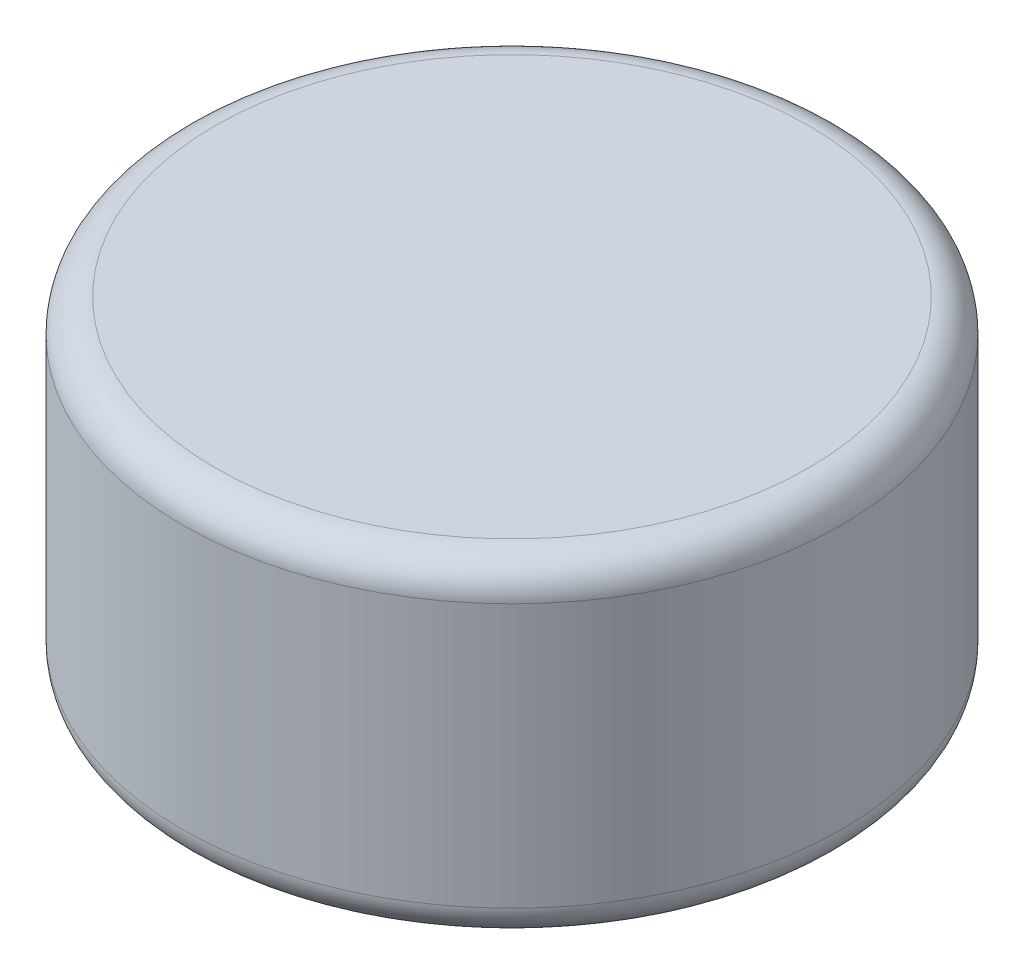
ISO-10303-21;
HEADER;
FILE_DESCRIPTION(('STEP AP214'),'2;1');
FILE_NAME('part.step','',(''),(''),'','','');
FILE_SCHEMA(('AUTOMOTIVE_DESIGN { 1 0 10303 214 1 1 1 1 }'));
ENDSEC;
DATA;
#1=APPLICATION_CONTEXT('core data for automotive mechanical design processes');
#2=APPLICATION_PROTOCOL_DEFINITION('international standard','automotive_design',2000,#1);
#3=PRODUCT_CONTEXT('',#1,'mechanical');
#4=PRODUCT('Part','Part','',(#3));
#5=PRODUCT_RELATED_PRODUCT_CATEGORY('part','',(#4));
#6=PRODUCT_DEFINITION_FORMATION('','',#4);
#7=PRODUCT_DEFINITION_CONTEXT('part definition',#1,'design');
#8=PRODUCT_DEFINITION('design','',#6,#7);
#9=PRODUCT_DEFINITION_SHAPE('','',#8);
#10=(LENGTH_UNIT() NAMED_UNIT(*) SI_UNIT(.MILLI.,.METRE.));
#11=(NAMED_UNIT(*) PLANE_ANGLE_UNIT() SI_UNIT($,.RADIAN.));
#12=(NAMED_UNIT(*) SI_UNIT($,.STERADIAN.) SOLID_ANGLE_UNIT());
#13=UNCERTAINTY_MEASURE_WITH_UNIT(LENGTH_MEASURE(1.E-05),#10,'distance_accuracy_value','');
#14=(GEOMETRIC_REPRESENTATION_CONTEXT(3) GLOBAL_UNCERTAINTY_ASSIGNED_CONTEXT((#13)) GLOBAL_UNIT_ASSIGNED_CONTEXT((#10,
#11,#12)) REPRESENTATION_CONTEXT('',''));
#15=CARTESIAN_POINT('',(0.,0.,0.));
#16=DIRECTION('',(0.,0.,1.));
#17=DIRECTION('',(1.,0.,0.));
#18=AXIS2_PLACEMENT_3D('',#15,#16,#17);
#19=CARTESIAN_POINT('',(0.,1.5875,0.));
#20=DIRECTION('',(0.,-1.,0.));
#21=DIRECTION('',(0.,0.,-1.));
#22=AXIS2_PLACEMENT_3D('',#19,#20,#21);
#23=CYLINDRICAL_SURFACE('',#22,3.175);
#24=CARTESIAN_POINT('',(0.,-1.27,0.));
#25=DIRECTION('',(0.,1.,0.));
#26=DIRECTION('',(0.,0.,1.));
#27=AXIS2_PLACEMENT_3D('',#24,#25,#26);
#28=CIRCLE('',#27,3.175);
#29=CARTESIAN_POINT('',(0.,-1.27,3.175));
#30=VERTEX_POINT('',#29);
#31=EDGE_CURVE('E41',#30,#30,#28,.T.);
#32=ORIENTED_EDGE('',*,*,#31,.T.);
#33=EDGE_LOOP('',(#32));
#34=FACE_BOUND('',#33,.T.);
#35=CARTESIAN_POINT('',(0.,1.27,0.));
#36=DIRECTION('',(0.,1.,0.));
#37=DIRECTION('',(0.,0.,1.));
#38=AXIS2_PLACEMENT_3D('',#35,#36,#37);
#39=CIRCLE('',#38,3.175);
#40=CARTESIAN_POINT('',(0.,1.27,3.175));
#41=VERTEX_POINT('',#40);
#42=EDGE_CURVE('E45',#41,#41,#39,.F.);
#43=ORIENTED_EDGE('',*,*,#42,.T.);
#44=EDGE_LOOP('',(#43));
#45=FACE_BOUND('',#44,.T.);
#46=ADVANCED_FACE('F30',(#34,#45),#23,.T.);
#47=CARTESIAN_POINT('',(0.,1.5875,0.));
#48=DIRECTION('',(0.,1.,0.));
#49=DIRECTION('',(0.,0.,1.));
#50=AXIS2_PLACEMENT_3D('',#47,#48,#49);
#51=PLANE('',#50);
#52=CARTESIAN_POINT('',(0.,1.5875,0.));
#53=DIRECTION('',(0.,1.,0.));
#54=DIRECTION('',(0.,0.,1.));
#55=AXIS2_PLACEMENT_3D('',#52,#53,#54);
#56=CIRCLE('',#55,2.8575);
#57=CARTESIAN_POINT('',(0.,1.5875,2.8575));
#58=VERTEX_POINT('',#57);
#59=EDGE_CURVE('E10',#58,#58,#56,.T.);
#60=ORIENTED_EDGE('',*,*,#59,.T.);
#61=EDGE_LOOP('',(#60));
#62=FACE_BOUND('',#61,.T.);
#63=ADVANCED_FACE('F61',(#62),#51,.T.);
#64=CARTESIAN_POINT('',(0.,-1.5875,0.));
#65=DIRECTION('',(0.,1.,0.));
#66=DIRECTION('',(0.,0.,1.));
#67=AXIS2_PLACEMENT_3D('',#64,#65,#66);
#68=PLANE('',#67);
#69=CARTESIAN_POINT('',(0.,-1.5875,0.));
#70=DIRECTION('',(0.,1.,0.));
#71=DIRECTION('',(0.,0.,1.));
#72=AXIS2_PLACEMENT_3D('',#69,#70,#71);
#73=CIRCLE('',#72,2.8575);
#74=CARTESIAN_POINT('',(0.,-1.5875,2.8575));
#75=VERTEX_POINT('',#74);
#76=EDGE_CURVE('E37',#75,#75,#73,.F.);
#77=ORIENTED_EDGE('',*,*,#76,.T.);
#78=EDGE_LOOP('',(#77));
#79=FACE_BOUND('',#78,.T.);
#80=ADVANCED_FACE('F58',(#79),#68,.F.);
#81=CARTESIAN_POINT('',(0.,-1.27,0.));
#82=DIRECTION('',(0.,1.,0.));
#83=DIRECTION('',(0.,0.,1.));
#84=AXIS2_PLACEMENT_3D('',#81,#82,#83);
#85=TOROIDAL_SURFACE('',#84,2.8575,0.3175);
#86=ORIENTED_EDGE('',*,*,#76,.F.);
#87=EDGE_LOOP('',(#86));
#88=FACE_BOUND('',#87,.T.);
#89=ORIENTED_EDGE('',*,*,#31,.F.);
#90=EDGE_LOOP('',(#89));
#91=FACE_BOUND('',#90,.T.);
#92=ADVANCED_FACE('F54',(#88,#91),#85,.T.);
#93=CARTESIAN_POINT('',(0.,1.27,0.));
#94=DIRECTION('',(0.,1.,0.));
#95=DIRECTION('',(0.,0.,1.));
#96=AXIS2_PLACEMENT_3D('',#93,#94,#95);
#97=TOROIDAL_SURFACE('',#96,2.8575,0.3175);
#98=ORIENTED_EDGE('',*,*,#42,.F.);
#99=EDGE_LOOP('',(#98));
#100=FACE_BOUND('',#99,.T.);
#101=ORIENTED_EDGE('',*,*,#59,.F.);
#102=EDGE_LOOP('',(#101));
#103=FACE_BOUND('',#102,.T.);
#104=ADVANCED_FACE('F32',(#100,#103),#97,.T.);
#105=CLOSED_SHELL('',(#46,#63,#80,#92,#104));
#106=MANIFOLD_SOLID_BREP('B2',#105);
#107=ADVANCED_BREP_SHAPE_REPRESENTATION('',(#18,#106),#14);
#108=SHAPE_DEFINITION_REPRESENTATION(#9,#107);
ENDSEC;
END-ISO-10303-21;
